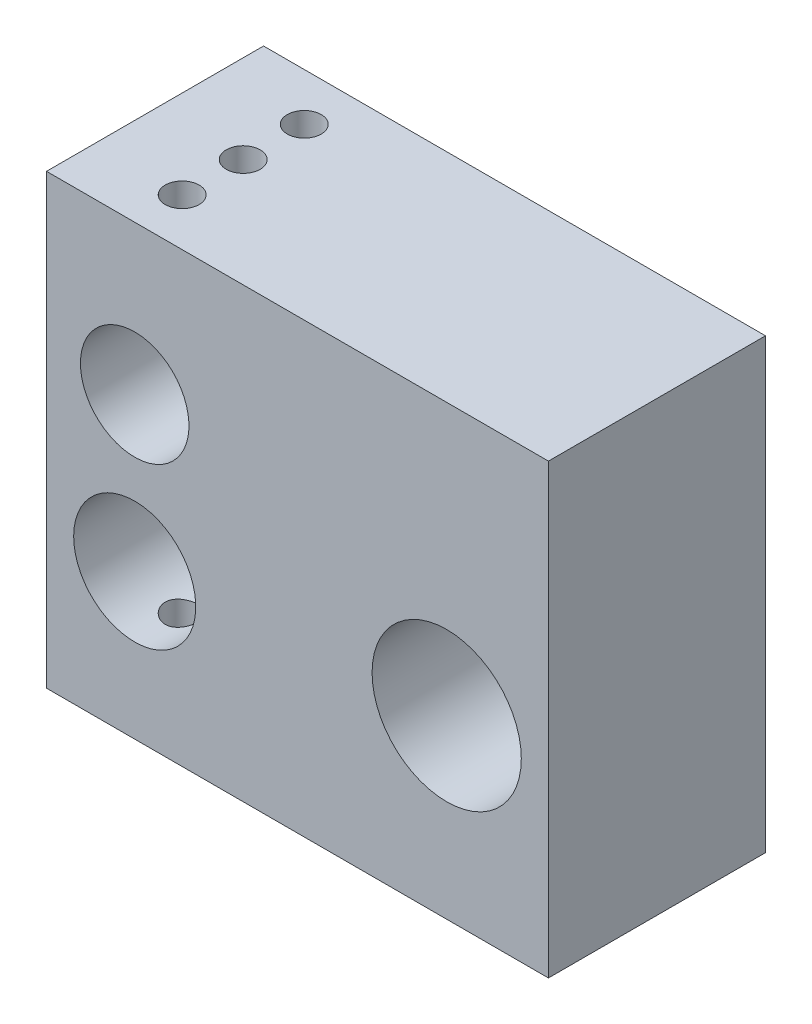
ISO-10303-21;
HEADER;
FILE_DESCRIPTION(('STEP AP214'),'2;1');
FILE_NAME('part.step','',(''),(''),'','','');
FILE_SCHEMA(('AUTOMOTIVE_DESIGN { 1 0 10303 214 1 1 1 1 }'));
ENDSEC;
DATA;
#1=APPLICATION_CONTEXT('core data for automotive mechanical design processes');
#2=APPLICATION_PROTOCOL_DEFINITION('international standard','automotive_design',2000,#1);
#3=PRODUCT_CONTEXT('',#1,'mechanical');
#4=PRODUCT('Part','Part','',(#3));
#5=PRODUCT_RELATED_PRODUCT_CATEGORY('part','',(#4));
#6=PRODUCT_DEFINITION_FORMATION('','',#4);
#7=PRODUCT_DEFINITION_CONTEXT('part definition',#1,'design');
#8=PRODUCT_DEFINITION('design','',#6,#7);
#9=PRODUCT_DEFINITION_SHAPE('','',#8);
#10=(LENGTH_UNIT() NAMED_UNIT(*) SI_UNIT(.MILLI.,.METRE.));
#11=(NAMED_UNIT(*) PLANE_ANGLE_UNIT() SI_UNIT($,.RADIAN.));
#12=(NAMED_UNIT(*) SI_UNIT($,.STERADIAN.) SOLID_ANGLE_UNIT());
#13=UNCERTAINTY_MEASURE_WITH_UNIT(LENGTH_MEASURE(1.E-05),#10,'distance_accuracy_value','');
#14=(GEOMETRIC_REPRESENTATION_CONTEXT(3) GLOBAL_UNCERTAINTY_ASSIGNED_CONTEXT((#13)) GLOBAL_UNIT_ASSIGNED_CONTEXT((#10,
#11,#12)) REPRESENTATION_CONTEXT('',''));
#15=CARTESIAN_POINT('',(0.,0.,0.));
#16=DIRECTION('',(0.,0.,1.));
#17=DIRECTION('',(1.,0.,0.));
#18=AXIS2_PLACEMENT_3D('',#15,#16,#17);
#19=CARTESIAN_POINT('',(-18.5,16.5,8.));
#20=DIRECTION('',(1.,0.,0.));
#21=DIRECTION('',(0.,0.,-1.));
#22=AXIS2_PLACEMENT_3D('',#19,#20,#21);
#23=PLANE('',#22);
#24=DIRECTION('',(0.,0.,1.));
#25=VECTOR('',#24,1.);
#26=CARTESIAN_POINT('',(-18.5,-16.5,8.));
#27=LINE('',#26,#25);
#28=CARTESIAN_POINT('',(-18.5,-16.5,-8.));
#29=VERTEX_POINT('',#28);
#30=CARTESIAN_POINT('',(-18.5,-16.5,8.));
#31=VERTEX_POINT('',#30);
#32=EDGE_CURVE('E99',#29,#31,#27,.T.);
#33=ORIENTED_EDGE('',*,*,#32,.T.);
#34=DIRECTION('',(0.,-1.,0.));
#35=VECTOR('',#34,1.);
#36=CARTESIAN_POINT('',(-18.5,16.5,8.));
#37=LINE('',#36,#35);
#38=CARTESIAN_POINT('',(-18.5,16.5,8.));
#39=VERTEX_POINT('',#38);
#40=EDGE_CURVE('E11',#39,#31,#37,.T.);
#41=ORIENTED_EDGE('',*,*,#40,.F.);
#42=DIRECTION('',(0.,0.,1.));
#43=VECTOR('',#42,1.);
#44=CARTESIAN_POINT('',(-18.5,16.5,8.));
#45=LINE('',#44,#43);
#46=CARTESIAN_POINT('',(-18.5,16.5,-8.));
#47=VERTEX_POINT('',#46);
#48=EDGE_CURVE('E87',#47,#39,#45,.T.);
#49=ORIENTED_EDGE('',*,*,#48,.F.);
#50=DIRECTION('',(0.,-1.,0.));
#51=VECTOR('',#50,1.);
#52=CARTESIAN_POINT('',(-18.5,16.5,-8.));
#53=LINE('',#52,#51);
#54=EDGE_CURVE('E95',#47,#29,#53,.T.);
#55=ORIENTED_EDGE('',*,*,#54,.T.);
#56=EDGE_LOOP('',(#33,#41,#49,#55));
#57=FACE_BOUND('',#56,.T.);
#58=ADVANCED_FACE('F36',(#57),#23,.F.);
#59=CARTESIAN_POINT('',(18.5,16.5,8.));
#60=DIRECTION('',(0.,0.,-1.));
#61=DIRECTION('',(-1.,0.,0.));
#62=AXIS2_PLACEMENT_3D('',#59,#60,#61);
#63=PLANE('',#62);
#64=CARTESIAN_POINT('',(-12.,5.5,8.00000000000001));
#65=DIRECTION('',(0.,0.,-1.));
#66=DIRECTION('',(-1.,0.,0.));
#67=AXIS2_PLACEMENT_3D('',#64,#65,#66);
#68=CIRCLE('',#67,4.);
#69=CARTESIAN_POINT('',(-16.,5.5,8.00000000000001));
#70=VERTEX_POINT('',#69);
#71=EDGE_CURVE('E122',#70,#70,#68,.T.);
#72=ORIENTED_EDGE('',*,*,#71,.T.);
#73=EDGE_LOOP('',(#72));
#74=FACE_BOUND('',#73,.T.);
#75=CARTESIAN_POINT('',(-12.,-5.8,8.00000000000001));
#76=DIRECTION('',(0.,0.,-1.));
#77=DIRECTION('',(-1.,0.,0.));
#78=AXIS2_PLACEMENT_3D('',#75,#76,#77);
#79=CIRCLE('',#78,4.5);
#80=CARTESIAN_POINT('',(-16.5,-5.8,8.00000000000001));
#81=VERTEX_POINT('',#80);
#82=EDGE_CURVE('E116',#81,#81,#79,.T.);
#83=ORIENTED_EDGE('',*,*,#82,.T.);
#84=EDGE_LOOP('',(#83));
#85=FACE_BOUND('',#84,.T.);
#86=CARTESIAN_POINT('',(11.,-3.5,8.));
#87=DIRECTION('',(0.,0.,1.));
#88=DIRECTION('',(1.,0.,0.));
#89=AXIS2_PLACEMENT_3D('',#86,#87,#88);
#90=CIRCLE('',#89,5.5);
#91=CARTESIAN_POINT('',(16.5,-3.5,8.));
#92=VERTEX_POINT('',#91);
#93=EDGE_CURVE('E113',#92,#92,#90,.T.);
#94=ORIENTED_EDGE('',*,*,#93,.F.);
#95=EDGE_LOOP('',(#94));
#96=FACE_BOUND('',#95,.T.);
#97=DIRECTION('',(1.,0.,0.));
#98=VECTOR('',#97,1.);
#99=CARTESIAN_POINT('',(18.5,-16.5,8.));
#100=LINE('',#99,#98);
#101=CARTESIAN_POINT('',(18.5,-16.5,8.));
#102=VERTEX_POINT('',#101);
#103=EDGE_CURVE('E91',#31,#102,#100,.T.);
#104=ORIENTED_EDGE('',*,*,#103,.T.);
#105=DIRECTION('',(0.,-1.,0.));
#106=VECTOR('',#105,1.);
#107=CARTESIAN_POINT('',(18.5,16.5,8.));
#108=LINE('',#107,#106);
#109=CARTESIAN_POINT('',(18.5,16.5,8.));
#110=VERTEX_POINT('',#109);
#111=EDGE_CURVE('E44',#110,#102,#108,.T.);
#112=ORIENTED_EDGE('',*,*,#111,.F.);
#113=DIRECTION('',(1.,0.,0.));
#114=VECTOR('',#113,1.);
#115=CARTESIAN_POINT('',(18.5,16.5,8.));
#116=LINE('',#115,#114);
#117=EDGE_CURVE('E82',#39,#110,#116,.T.);
#118=ORIENTED_EDGE('',*,*,#117,.F.);
#119=ORIENTED_EDGE('',*,*,#40,.T.);
#120=EDGE_LOOP('',(#104,#112,#118,#119));
#121=FACE_BOUND('',#120,.T.);
#122=ADVANCED_FACE('F90',(#74,#85,#96,#121),#63,.F.);
#123=CARTESIAN_POINT('',(18.5,16.5,8.));
#124=DIRECTION('',(-1.,0.,0.));
#125=DIRECTION('',(0.,0.,1.));
#126=AXIS2_PLACEMENT_3D('',#123,#124,#125);
#127=PLANE('',#126);
#128=DIRECTION('',(0.,0.,-1.));
#129=VECTOR('',#128,1.);
#130=CARTESIAN_POINT('',(18.5,-16.5,8.));
#131=LINE('',#130,#129);
#132=CARTESIAN_POINT('',(18.5,-16.5,-8.));
#133=VERTEX_POINT('',#132);
#134=EDGE_CURVE('E69',#102,#133,#131,.T.);
#135=ORIENTED_EDGE('',*,*,#134,.T.);
#136=DIRECTION('',(0.,-1.,0.));
#137=VECTOR('',#136,1.);
#138=CARTESIAN_POINT('',(18.5,16.5,-8.));
#139=LINE('',#138,#137);
#140=CARTESIAN_POINT('',(18.5,16.5,-8.));
#141=VERTEX_POINT('',#140);
#142=EDGE_CURVE('E92',#141,#133,#139,.T.);
#143=ORIENTED_EDGE('',*,*,#142,.F.);
#144=DIRECTION('',(0.,0.,-1.));
#145=VECTOR('',#144,1.);
#146=CARTESIAN_POINT('',(18.5,16.5,8.));
#147=LINE('',#146,#145);
#148=EDGE_CURVE('E85',#110,#141,#147,.T.);
#149=ORIENTED_EDGE('',*,*,#148,.F.);
#150=ORIENTED_EDGE('',*,*,#111,.T.);
#151=EDGE_LOOP('',(#135,#143,#149,#150));
#152=FACE_BOUND('',#151,.T.);
#153=ADVANCED_FACE('F93',(#152),#127,.F.);
#154=CARTESIAN_POINT('',(18.5,16.5,-8.));
#155=DIRECTION('',(0.,0.,1.));
#156=DIRECTION('',(1.,0.,0.));
#157=AXIS2_PLACEMENT_3D('',#154,#155,#156);
#158=PLANE('',#157);
#159=CARTESIAN_POINT('',(-12.,5.5,-8.));
#160=DIRECTION('',(0.,0.,-1.));
#161=DIRECTION('',(-1.,0.,0.));
#162=AXIS2_PLACEMENT_3D('',#159,#160,#161);
#163=CIRCLE('',#162,4.);
#164=CARTESIAN_POINT('',(-16.,5.5,-8.));
#165=VERTEX_POINT('',#164);
#166=EDGE_CURVE('E125',#165,#165,#163,.T.);
#167=ORIENTED_EDGE('',*,*,#166,.F.);
#168=EDGE_LOOP('',(#167));
#169=FACE_BOUND('',#168,.T.);
#170=CARTESIAN_POINT('',(-12.,-5.8,-8.));
#171=DIRECTION('',(0.,0.,-1.));
#172=DIRECTION('',(-1.,0.,0.));
#173=AXIS2_PLACEMENT_3D('',#170,#171,#172);
#174=CIRCLE('',#173,4.5);
#175=CARTESIAN_POINT('',(-16.5,-5.8,-8.));
#176=VERTEX_POINT('',#175);
#177=EDGE_CURVE('E119',#176,#176,#174,.T.);
#178=ORIENTED_EDGE('',*,*,#177,.F.);
#179=EDGE_LOOP('',(#178));
#180=FACE_BOUND('',#179,.T.);
#181=CARTESIAN_POINT('',(11.,-3.5,-8.));
#182=DIRECTION('',(0.,0.,1.));
#183=DIRECTION('',(1.,0.,0.));
#184=AXIS2_PLACEMENT_3D('',#181,#182,#183);
#185=CIRCLE('',#184,5.5);
#186=CARTESIAN_POINT('',(16.5,-3.5,-8.));
#187=VERTEX_POINT('',#186);
#188=EDGE_CURVE('E102',#187,#187,#185,.T.);
#189=ORIENTED_EDGE('',*,*,#188,.T.);
#190=EDGE_LOOP('',(#189));
#191=FACE_BOUND('',#190,.T.);
#192=DIRECTION('',(-1.,0.,0.));
#193=VECTOR('',#192,1.);
#194=CARTESIAN_POINT('',(18.5,-16.5,-8.));
#195=LINE('',#194,#193);
#196=EDGE_CURVE('E75',#133,#29,#195,.T.);
#197=ORIENTED_EDGE('',*,*,#196,.T.);
#198=ORIENTED_EDGE('',*,*,#54,.F.);
#199=DIRECTION('',(-1.,0.,0.));
#200=VECTOR('',#199,1.);
#201=CARTESIAN_POINT('',(18.5,16.5,-8.));
#202=LINE('',#201,#200);
#203=EDGE_CURVE('E52',#141,#47,#202,.T.);
#204=ORIENTED_EDGE('',*,*,#203,.F.);
#205=ORIENTED_EDGE('',*,*,#142,.T.);
#206=EDGE_LOOP('',(#197,#198,#204,#205));
#207=FACE_BOUND('',#206,.T.);
#208=ADVANCED_FACE('F107',(#169,#180,#191,#207),#158,.F.);
#209=CARTESIAN_POINT('',(0.,16.5,0.));
#210=DIRECTION('',(0.,1.,0.));
#211=DIRECTION('',(0.,0.,1.));
#212=AXIS2_PLACEMENT_3D('',#209,#210,#211);
#213=PLANE('',#212);
#214=CARTESIAN_POINT('',(-12.,16.5,0.));
#215=DIRECTION('',(0.,1.,0.));
#216=DIRECTION('',(0.,0.,1.));
#217=AXIS2_PLACEMENT_3D('',#214,#215,#216);
#218=CIRCLE('',#217,1.24999999999999);
#219=CARTESIAN_POINT('',(-12.,16.5,1.25));
#220=VERTEX_POINT('',#219);
#221=EDGE_CURVE('E193',#220,#220,#218,.T.);
#222=ORIENTED_EDGE('',*,*,#221,.F.);
#223=EDGE_LOOP('',(#222));
#224=FACE_BOUND('',#223,.T.);
#225=CARTESIAN_POINT('',(-12.,16.5,4.5));
#226=DIRECTION('',(0.,1.,0.));
#227=DIRECTION('',(0.,0.,1.));
#228=AXIS2_PLACEMENT_3D('',#225,#226,#227);
#229=CIRCLE('',#228,1.24999999999999);
#230=CARTESIAN_POINT('',(-12.,16.5,5.74999999999999));
#231=VERTEX_POINT('',#230);
#232=EDGE_CURVE('E157',#231,#231,#229,.T.);
#233=ORIENTED_EDGE('',*,*,#232,.F.);
#234=EDGE_LOOP('',(#233));
#235=FACE_BOUND('',#234,.T.);
#236=CARTESIAN_POINT('',(-12.,16.5,-4.5));
#237=DIRECTION('',(0.,1.,0.));
#238=DIRECTION('',(0.,0.,1.));
#239=AXIS2_PLACEMENT_3D('',#236,#237,#238);
#240=CIRCLE('',#239,1.24999999999999);
#241=CARTESIAN_POINT('',(-12.,16.5,-3.25000000000001));
#242=VERTEX_POINT('',#241);
#243=EDGE_CURVE('E137',#242,#242,#240,.T.);
#244=ORIENTED_EDGE('',*,*,#243,.F.);
#245=EDGE_LOOP('',(#244));
#246=FACE_BOUND('',#245,.T.);
#247=ORIENTED_EDGE('',*,*,#48,.T.);
#248=ORIENTED_EDGE('',*,*,#117,.T.);
#249=ORIENTED_EDGE('',*,*,#148,.T.);
#250=ORIENTED_EDGE('',*,*,#203,.T.);
#251=EDGE_LOOP('',(#247,#248,#249,#250));
#252=FACE_BOUND('',#251,.T.);
#253=ADVANCED_FACE('F83',(#224,#235,#246,#252),#213,.T.);
#254=CARTESIAN_POINT('',(0.,-16.5,0.));
#255=DIRECTION('',(0.,1.,0.));
#256=DIRECTION('',(0.,0.,1.));
#257=AXIS2_PLACEMENT_3D('',#254,#255,#256);
#258=PLANE('',#257);
#259=CARTESIAN_POINT('',(-12.,-16.5,4.5));
#260=DIRECTION('',(0.,-1.,0.));
#261=DIRECTION('',(0.,0.,-1.));
#262=AXIS2_PLACEMENT_3D('',#259,#260,#261);
#263=CIRCLE('',#262,1.24999999999999);
#264=CARTESIAN_POINT('',(-12.,-16.5,3.25000000000002));
#265=VERTEX_POINT('',#264);
#266=EDGE_CURVE('E184',#265,#265,#263,.T.);
#267=ORIENTED_EDGE('',*,*,#266,.F.);
#268=EDGE_LOOP('',(#267));
#269=FACE_BOUND('',#268,.T.);
#270=CARTESIAN_POINT('',(-12.,-16.5,-4.5));
#271=DIRECTION('',(0.,-1.,0.));
#272=DIRECTION('',(0.,0.,-1.));
#273=AXIS2_PLACEMENT_3D('',#270,#271,#272);
#274=CIRCLE('',#273,1.24999999999999);
#275=CARTESIAN_POINT('',(-12.,-16.5,-5.74999999999999));
#276=VERTEX_POINT('',#275);
#277=EDGE_CURVE('E166',#276,#276,#274,.T.);
#278=ORIENTED_EDGE('',*,*,#277,.F.);
#279=EDGE_LOOP('',(#278));
#280=FACE_BOUND('',#279,.T.);
#281=ORIENTED_EDGE('',*,*,#32,.F.);
#282=ORIENTED_EDGE('',*,*,#196,.F.);
#283=ORIENTED_EDGE('',*,*,#134,.F.);
#284=ORIENTED_EDGE('',*,*,#103,.F.);
#285=EDGE_LOOP('',(#281,#282,#283,#284));
#286=FACE_BOUND('',#285,.T.);
#287=ADVANCED_FACE('F110',(#269,#280,#286),#258,.F.);
#288=CARTESIAN_POINT('',(11.,-3.5,-8.));
#289=DIRECTION('',(0.,0.,1.));
#290=DIRECTION('',(1.,0.,0.));
#291=AXIS2_PLACEMENT_3D('',#288,#289,#290);
#292=CYLINDRICAL_SURFACE('',#291,5.5);
#293=ORIENTED_EDGE('',*,*,#188,.F.);
#294=EDGE_LOOP('',(#293));
#295=FACE_BOUND('',#294,.T.);
#296=ORIENTED_EDGE('',*,*,#93,.T.);
#297=EDGE_LOOP('',(#296));
#298=FACE_BOUND('',#297,.T.);
#299=ADVANCED_FACE('F221',(#295,#298),#292,.F.);
#300=CARTESIAN_POINT('',(-12.,-5.8,8.00000000000001));
#301=DIRECTION('',(0.,0.,-1.));
#302=DIRECTION('',(-1.,0.,0.));
#303=AXIS2_PLACEMENT_3D('',#300,#301,#302);
#304=CYLINDRICAL_SURFACE('',#303,4.5);
#305=CARTESIAN_POINT('',(-12.,-10.3,3.25000000000001));
#306=CARTESIAN_POINT('',(-11.9311987491168,-10.2999990801693,3.25000139958524));
#307=CARTESIAN_POINT('',(-11.8623828762473,-10.2984067408683,3.25569931980531));
#308=CARTESIAN_POINT('',(-11.7267405240058,-10.2922095019824,3.27829572826533));
#309=CARTESIAN_POINT('',(-11.6599148963366,-10.2876033314925,3.29519894171373));
#310=CARTESIAN_POINT('',(-11.5302300503197,-10.275885653946,3.33960871941394));
#311=CARTESIAN_POINT('',(-11.4673656099043,-10.2687775303096,3.36710096869843));
#312=CARTESIAN_POINT('',(-11.3471393047582,-10.25280312582,3.43185350632688));
#313=CARTESIAN_POINT('',(-11.2897779291877,-10.2439366888869,3.46911466191927));
#314=CARTESIAN_POINT('',(-11.1807532152841,-10.2251515781749,3.55332943384287));
#315=CARTESIAN_POINT('',(-11.1292468871915,-10.215213736237,3.60048203968756));
#316=CARTESIAN_POINT('',(-11.0347618143037,-10.1955260711726,3.7027162771216));
#317=CARTESIAN_POINT('',(-10.9917842691545,-10.1857762746702,3.75779902227524));
#318=CARTESIAN_POINT('',(-10.9147919141968,-10.1673704429455,3.87560726012932));
#319=CARTESIAN_POINT('',(-10.8809612505216,-10.1587384794598,3.93845720844372));
#320=CARTESIAN_POINT('',(-10.8244104286886,-10.143829008083,4.06923191764013));
#321=CARTESIAN_POINT('',(-10.8016880266376,-10.1375510247425,4.13715565040817));
#322=CARTESIAN_POINT('',(-10.7685507563204,-10.1282588314288,4.27440278885413));
#323=CARTESIAN_POINT('',(-10.757849630957,-10.125168860032,4.34365182163988));
#324=CARTESIAN_POINT('',(-10.7481657292203,-10.122376493848,4.48302588556283));
#325=CARTESIAN_POINT('',(-10.749180559727,-10.1226734072502,4.5531507348812));
#326=CARTESIAN_POINT('',(-10.7626732866238,-10.1265536680145,4.69002227872271));
#327=CARTESIAN_POINT('',(-10.7748009772933,-10.1300366066859,4.75680680149622));
#328=CARTESIAN_POINT('',(-10.809612687981,-10.1397351705348,4.8873536285916));
#329=CARTESIAN_POINT('',(-10.8322976154284,-10.1459510306134,4.95111567260226));
#330=CARTESIAN_POINT('',(-10.8878562686554,-10.1605006977575,5.07470223145528));
#331=CARTESIAN_POINT('',(-10.9208497816301,-10.168859186002,5.13446986681006));
#332=CARTESIAN_POINT('',(-10.9960055932037,-10.186739506843,5.24774157559124));
#333=CARTESIAN_POINT('',(-11.0381698337094,-10.1962615856432,5.30124431872614));
#334=CARTESIAN_POINT('',(-11.1322443897156,-10.2158107212683,5.40246388043642));
#335=CARTESIAN_POINT('',(-11.1844477202977,-10.2258437003779,5.44990763487985));
#336=CARTESIAN_POINT('',(-11.296193392799,-10.2449819981083,5.53542573077781));
#337=CARTESIAN_POINT('',(-11.355736074578,-10.2540872737346,5.57349963810248));
#338=CARTESIAN_POINT('',(-11.4809165706619,-10.2704083971276,5.63933181563007));
#339=CARTESIAN_POINT('',(-11.5465836042523,-10.2776144864553,5.6670371039389));
#340=CARTESIAN_POINT('',(-11.6818900112303,-10.2892549250145,5.71093409844137));
#341=CARTESIAN_POINT('',(-11.7515284358789,-10.293689933237,5.72712854215656));
#342=CARTESIAN_POINT('',(-11.8904733922869,-10.2991873648341,5.74710713677897));
#343=CARTESIAN_POINT('',(-11.9597226941413,-10.3003505382403,5.75126214490716));
#344=CARTESIAN_POINT('',(-12.0979299306366,-10.2994648029316,5.74807300170757));
#345=CARTESIAN_POINT('',(-12.1668878972845,-10.2974162567817,5.74073014835195));
#346=CARTESIAN_POINT('',(-12.3012069134709,-10.2904026505903,5.71505666588036));
#347=CARTESIAN_POINT('',(-12.3666112881639,-10.2854933716758,5.69693605494248));
#348=CARTESIAN_POINT('',(-12.4934431181187,-10.2733182916935,5.6504681323619));
#349=CARTESIAN_POINT('',(-12.5548701239724,-10.2660522248846,5.62211966743049));
#350=CARTESIAN_POINT('',(-12.6734201404054,-10.2497374028418,5.5553341219535));
#351=CARTESIAN_POINT('',(-12.7304270619535,-10.2406547134057,5.51669947567733));
#352=CARTESIAN_POINT('',(-12.837277670587,-10.2217547712821,5.43068386419253));
#353=CARTESIAN_POINT('',(-12.8871198146314,-10.2119373610519,5.38330101993424));
#354=CARTESIAN_POINT('',(-12.979812026945,-10.1922984268438,5.27939855612165));
#355=CARTESIAN_POINT('',(-13.0223995788538,-10.1824860820796,5.22264254844243));
#356=CARTESIAN_POINT('',(-13.0974558142901,-10.1642969330427,5.10257936212026));
#357=CARTESIAN_POINT('',(-13.1299248848246,-10.1559200738716,5.0392724341574));
#358=CARTESIAN_POINT('',(-13.1835810583415,-10.1416479895617,4.90819283011683));
#359=CARTESIAN_POINT('',(-13.2048307748478,-10.1357390309604,4.84044736224536));
#360=CARTESIAN_POINT('',(-13.2355765249536,-10.1270787689278,4.70215029058324));
#361=CARTESIAN_POINT('',(-13.2450758790657,-10.1243265734489,4.63159948536688));
#362=CARTESIAN_POINT('',(-13.2518485997432,-10.1223703832988,4.49239422050922));
#363=CARTESIAN_POINT('',(-13.2495457101458,-10.1230434046118,4.42376180998806));
#364=CARTESIAN_POINT('',(-13.2337714328726,-10.1275713705212,4.28790510620532));
#365=CARTESIAN_POINT('',(-13.2203003804941,-10.1314262195909,4.22068077073177));
#366=CARTESIAN_POINT('',(-13.1828272424861,-10.14180718808,4.09013276608194));
#367=CARTESIAN_POINT('',(-13.1589221464112,-10.1483086691328,4.02677915735225));
#368=CARTESIAN_POINT('',(-13.1013345167073,-10.1632491605205,3.90493257749269));
#369=CARTESIAN_POINT('',(-13.0676503335869,-10.171688497674,3.84644042851432));
#370=CARTESIAN_POINT('',(-12.990206962021,-10.1898881078538,3.73397234717483));
#371=CARTESIAN_POINT('',(-12.9461620843463,-10.1996817898226,3.68019852331728));
#372=CARTESIAN_POINT('',(-12.8497815274507,-10.2193083190936,3.58066762794655));
#373=CARTESIAN_POINT('',(-12.7974437956282,-10.2291411755031,3.53491254710902));
#374=CARTESIAN_POINT('',(-12.6844602323079,-10.2480183958155,3.45164186342193));
#375=CARTESIAN_POINT('',(-12.6236462589322,-10.2570384119279,3.41434837668933));
#376=CARTESIAN_POINT('',(-12.4963619826928,-10.2729997490061,3.35057186071053));
#377=CARTESIAN_POINT('',(-12.4298950301767,-10.2799422903534,3.32408248141899));
#378=CARTESIAN_POINT('',(-12.3031454837667,-10.2901607483195,3.28577991926531));
#379=CARTESIAN_POINT('',(-12.2433644021687,-10.2938224566186,3.27239521240714));
#380=CARTESIAN_POINT('',(-12.1223926256934,-10.2987423497629,3.25450515417747));
#381=CARTESIAN_POINT('',(-12.0612020980194,-10.3000008182347,3.24999875500008));
#382=CARTESIAN_POINT('',(-12.,-10.3,3.25000000000001));
#383=B_SPLINE_CURVE_WITH_KNOTS('',3,(#305,#306,#307,#308,#309,#310,#311,#312,#313,#314,#315,
#316,#317,#318,#319,#320,#321,#322,#323,#324,#325,#326,#327,#328,#329,#330,#331,#332,#333,#334,
#335,#336,#337,#338,#339,#340,#341,#342,#343,#344,#345,#346,#347,#348,#349,#350,#351,#352,#353,
#354,#355,#356,#357,#358,#359,#360,#361,#362,#363,#364,#365,#366,#367,#368,#369,#370,#371,#372,
#373,#374,#375,#376,#377,#378,#379,#380,#381,#382),.UNSPECIFIED.,.T.,.F.,(4,2,2,2,2,2,2,2,2,2,2,
2,2,2,2,2,2,2,2,2,2,2,2,2,2,2,2,2,2,2,2,2,2,2,2,2,2,2,4),(0.,0.20617919309949,0.412445386147259,
0.618433707942853,0.824440322837929,1.03507624325264,1.24574177043995,1.46037690323671,
1.67496866133383,1.88433431939188,2.09365721284143,2.29660232990421,2.49956489399152,
2.70497960040654,2.91043784592673,3.1231949383816,3.33596188658144,3.54980165635948,
3.76359055350005,3.97072010588424,4.17782627748475,4.38102317477484,4.58424299163036,
4.79168948884223,4.99918059600961,5.21305991702848,5.42693105668197,5.63959564853969,
5.85220013017264,6.05722599244304,6.26224569952545,6.46539893556021,6.66858645848125,
6.87821913273767,7.08790377540616,7.30258090584729,7.51713167871714,7.70055986525025,
7.8839664025393),.UNSPECIFIED.);
#384=CARTESIAN_POINT('',(-12.,-10.3,3.25000000000001));
#385=VERTEX_POINT('',#384);
#386=EDGE_CURVE('E179',#385,#385,#383,.T.);
#387=ORIENTED_EDGE('',*,*,#386,.T.);
#388=EDGE_LOOP('',(#387));
#389=FACE_BOUND('',#388,.T.);
#390=CARTESIAN_POINT('',(-12.,-10.3,-5.74999999999999));
#391=CARTESIAN_POINT('',(-11.9311987491168,-10.2999990801693,-5.74999860041476));
#392=CARTESIAN_POINT('',(-11.8623828762473,-10.2984067408683,-5.7443006801947));
#393=CARTESIAN_POINT('',(-11.7267405240058,-10.2922095019824,-5.72170427173467));
#394=CARTESIAN_POINT('',(-11.6599148963366,-10.2876033314925,-5.70480105828627));
#395=CARTESIAN_POINT('',(-11.5302300503197,-10.275885653946,-5.66039128058607));
#396=CARTESIAN_POINT('',(-11.4673656099043,-10.2687775303096,-5.63289903130158));
#397=CARTESIAN_POINT('',(-11.3471393047582,-10.25280312582,-5.56814649367313));
#398=CARTESIAN_POINT('',(-11.2897779291877,-10.2439366888869,-5.53088533808074));
#399=CARTESIAN_POINT('',(-11.1807532152841,-10.2251515781749,-5.44667056615713));
#400=CARTESIAN_POINT('',(-11.1292468871915,-10.215213736237,-5.39951796031245));
#401=CARTESIAN_POINT('',(-11.0347618143037,-10.1955260711726,-5.2972837228784));
#402=CARTESIAN_POINT('',(-10.9917842691545,-10.1857762746702,-5.24220097772476));
#403=CARTESIAN_POINT('',(-10.9147919141968,-10.1673704429455,-5.12439273987068));
#404=CARTESIAN_POINT('',(-10.8809612505216,-10.1587384794598,-5.06154279155628));
#405=CARTESIAN_POINT('',(-10.8244104286886,-10.143829008083,-4.93076808235988));
#406=CARTESIAN_POINT('',(-10.8016880266376,-10.1375510247425,-4.86284434959184));
#407=CARTESIAN_POINT('',(-10.7685507563205,-10.1282588314288,-4.72559721114588));
#408=CARTESIAN_POINT('',(-10.757849630957,-10.125168860032,-4.65634817836012));
#409=CARTESIAN_POINT('',(-10.7481657292203,-10.122376493848,-4.51697411443717));
#410=CARTESIAN_POINT('',(-10.749180559727,-10.1226734072502,-4.44684926511881));
#411=CARTESIAN_POINT('',(-10.7626732866238,-10.1265536680145,-4.3099777212773));
#412=CARTESIAN_POINT('',(-10.7748009772933,-10.1300366066859,-4.24319319850379));
#413=CARTESIAN_POINT('',(-10.809612687981,-10.1397351705348,-4.11264637140841));
#414=CARTESIAN_POINT('',(-10.8322976154284,-10.1459510306134,-4.04888432739775));
#415=CARTESIAN_POINT('',(-10.8878562686554,-10.1605006977575,-3.92529776854472));
#416=CARTESIAN_POINT('',(-10.9208497816301,-10.168859186002,-3.86553013318995));
#417=CARTESIAN_POINT('',(-10.9960055932037,-10.186739506843,-3.75225842440876));
#418=CARTESIAN_POINT('',(-11.0381698337094,-10.1962615856432,-3.69875568127387));
#419=CARTESIAN_POINT('',(-11.1322443897156,-10.2158107212683,-3.59753611956359));
#420=CARTESIAN_POINT('',(-11.1844477202977,-10.2258437003779,-3.55009236512016));
#421=CARTESIAN_POINT('',(-11.296193392799,-10.2449819981083,-3.4645742692222));
#422=CARTESIAN_POINT('',(-11.355736074578,-10.2540872737346,-3.42650036189753));
#423=CARTESIAN_POINT('',(-11.4809165706619,-10.2704083971276,-3.36066818436993));
#424=CARTESIAN_POINT('',(-11.5465836042523,-10.2776144864553,-3.3329628960611));
#425=CARTESIAN_POINT('',(-11.6818900112303,-10.2892549250145,-3.28906590155864));
#426=CARTESIAN_POINT('',(-11.7515284358789,-10.293689933237,-3.27287145784344));
#427=CARTESIAN_POINT('',(-11.8904733922869,-10.2991873648341,-3.25289286322103));
#428=CARTESIAN_POINT('',(-11.9597226941413,-10.3003505382403,-3.24873785509284));
#429=CARTESIAN_POINT('',(-12.0979299306366,-10.2994648029316,-3.25192699829244));
#430=CARTESIAN_POINT('',(-12.1668878972845,-10.2974162567817,-3.25926985164806));
#431=CARTESIAN_POINT('',(-12.3012069134709,-10.2904026505903,-3.28494333411964));
#432=CARTESIAN_POINT('',(-12.3666112881639,-10.2854933716758,-3.30306394505753));
#433=CARTESIAN_POINT('',(-12.4934431181187,-10.2733182916935,-3.3495318676381));
#434=CARTESIAN_POINT('',(-12.5548701239724,-10.2660522248846,-3.37788033256952));
#435=CARTESIAN_POINT('',(-12.6734201404054,-10.2497374028418,-3.4446658780465));
#436=CARTESIAN_POINT('',(-12.7304270619535,-10.2406547134057,-3.48330052432267));
#437=CARTESIAN_POINT('',(-12.837277670587,-10.2217547712821,-3.56931613580747));
#438=CARTESIAN_POINT('',(-12.8871198146314,-10.2119373610519,-3.61669898006577));
#439=CARTESIAN_POINT('',(-12.9798120269449,-10.1922984268438,-3.72060144387835));
#440=CARTESIAN_POINT('',(-13.0223995788538,-10.1824860820796,-3.77735745155757));
#441=CARTESIAN_POINT('',(-13.0974558142901,-10.1642969330427,-3.89742063787974));
#442=CARTESIAN_POINT('',(-13.1299248848246,-10.1559200738716,-3.9607275658426));
#443=CARTESIAN_POINT('',(-13.1835810583415,-10.1416479895617,-4.09180716988317));
#444=CARTESIAN_POINT('',(-13.2048307748478,-10.1357390309604,-4.15955263775464));
#445=CARTESIAN_POINT('',(-13.2355765249536,-10.1270787689278,-4.29784970941676));
#446=CARTESIAN_POINT('',(-13.2450758790657,-10.1243265734489,-4.36840051463312));
#447=CARTESIAN_POINT('',(-13.2518485997432,-10.1223703832988,-4.50760577949078));
#448=CARTESIAN_POINT('',(-13.2495457101458,-10.1230434046118,-4.57623819001194));
#449=CARTESIAN_POINT('',(-13.2337714328726,-10.1275713705212,-4.71209489379468));
#450=CARTESIAN_POINT('',(-13.2203003804941,-10.1314262195909,-4.77931922926823));
#451=CARTESIAN_POINT('',(-13.1828272424861,-10.14180718808,-4.90986723391806));
#452=CARTESIAN_POINT('',(-13.1589221464112,-10.1483086691328,-4.97322084264776));
#453=CARTESIAN_POINT('',(-13.1013345167073,-10.1632491605205,-5.09506742250732));
#454=CARTESIAN_POINT('',(-13.0676503335869,-10.171688497674,-5.15355957148568));
#455=CARTESIAN_POINT('',(-12.990206962021,-10.1898881078538,-5.26602765282517));
#456=CARTESIAN_POINT('',(-12.9461620843463,-10.1996817898226,-5.31980147668272));
#457=CARTESIAN_POINT('',(-12.8497815274507,-10.2193083190936,-5.41933237205345));
#458=CARTESIAN_POINT('',(-12.7974437956282,-10.2291411755031,-5.46508745289098));
#459=CARTESIAN_POINT('',(-12.6844602323079,-10.2480183958155,-5.54835813657808));
#460=CARTESIAN_POINT('',(-12.6236462589322,-10.2570384119279,-5.58565162331068));
#461=CARTESIAN_POINT('',(-12.4963619826928,-10.2729997490061,-5.64942813928947));
#462=CARTESIAN_POINT('',(-12.4298950301767,-10.2799422903534,-5.67591751858101));
#463=CARTESIAN_POINT('',(-12.3031454837667,-10.2901607483195,-5.71422008073469));
#464=CARTESIAN_POINT('',(-12.2433644021687,-10.2938224566186,-5.72760478759287));
#465=CARTESIAN_POINT('',(-12.1223926256934,-10.2987423497629,-5.74549484582254));
#466=CARTESIAN_POINT('',(-12.0612020980194,-10.3000008182347,-5.75000124499992));
#467=CARTESIAN_POINT('',(-12.,-10.3,-5.74999999999999));
#468=B_SPLINE_CURVE_WITH_KNOTS('',3,(#390,#391,#392,#393,#394,#395,#396,#397,#398,#399,#400,
#401,#402,#403,#404,#405,#406,#407,#408,#409,#410,#411,#412,#413,#414,#415,#416,#417,#418,#419,
#420,#421,#422,#423,#424,#425,#426,#427,#428,#429,#430,#431,#432,#433,#434,#435,#436,#437,#438,
#439,#440,#441,#442,#443,#444,#445,#446,#447,#448,#449,#450,#451,#452,#453,#454,#455,#456,#457,
#458,#459,#460,#461,#462,#463,#464,#465,#466,#467),.UNSPECIFIED.,.T.,.F.,(4,2,2,2,2,2,2,2,2,2,2,
2,2,2,2,2,2,2,2,2,2,2,2,2,2,2,2,2,2,2,2,2,2,2,2,2,2,2,4),(0.,0.20617919309949,0.412445386147257,
0.618433707942851,0.824440322837926,1.03507624325263,1.24574177043994,1.46037690323671,
1.67496866133383,1.88433431939188,2.09365721284143,2.2966023299042,2.49956489399151,
2.70497960040654,2.91043784592673,3.1231949383816,3.33596188658144,3.54980165635947,
3.76359055350004,3.97072010588424,4.17782627748474,4.38102317477484,4.58424299163036,
4.79168948884223,4.99918059600961,5.21305991702847,5.42693105668197,5.63959564853968,
5.85220013017263,6.05722599244304,6.26224569952544,6.46539893556021,6.66858645848124,
6.87821913273766,7.08790377540616,7.30258090584728,7.51713167871714,7.70055986525025,
7.8839664025393),.UNSPECIFIED.);
#469=CARTESIAN_POINT('',(-12.,-10.3,-5.74999999999999));
#470=VERTEX_POINT('',#469);
#471=EDGE_CURVE('E160',#470,#470,#468,.T.);
#472=ORIENTED_EDGE('',*,*,#471,.T.);
#473=EDGE_LOOP('',(#472));
#474=FACE_BOUND('',#473,.T.);
#475=ORIENTED_EDGE('',*,*,#82,.F.);
#476=EDGE_LOOP('',(#475));
#477=FACE_BOUND('',#476,.T.);
#478=ORIENTED_EDGE('',*,*,#177,.T.);
#479=EDGE_LOOP('',(#478));
#480=FACE_BOUND('',#479,.T.);
#481=ADVANCED_FACE('F228',(#389,#474,#477,#480),#304,.F.);
#482=CARTESIAN_POINT('',(-12.,5.5,8.00000000000001));
#483=DIRECTION('',(0.,0.,-1.));
#484=DIRECTION('',(-1.,0.,0.));
#485=AXIS2_PLACEMENT_3D('',#482,#483,#484);
#486=CYLINDRICAL_SURFACE('',#485,4.);
#487=CARTESIAN_POINT('',(-12.,9.5,1.25));
#488=CARTESIAN_POINT('',(-11.9315608148255,9.49999965877989,1.24999955341242));
#489=CARTESIAN_POINT('',(-11.8631169474971,9.49822694984841,1.24436077305555));
#490=CARTESIAN_POINT('',(-11.7282307904116,9.49132894088806,1.22201375846076));
#491=CARTESIAN_POINT('',(-11.6617889572741,9.48620288199859,1.20530301863564));
#492=CARTESIAN_POINT('',(-11.5328714563492,9.47315815697909,1.16143062880426));
#493=CARTESIAN_POINT('',(-11.4703898230142,9.46524381499025,1.13428515534703));
#494=CARTESIAN_POINT('',(-11.3508651976535,9.44743969161092,1.07038268232167));
#495=CARTESIAN_POINT('',(-11.2938230645551,9.43754959899905,1.03362416821942));
#496=CARTESIAN_POINT('',(-11.1850346650477,9.41650213740282,0.950344007982643));
#497=CARTESIAN_POINT('',(-11.1334799718433,9.40531715926988,0.903579114938932));
#498=CARTESIAN_POINT('',(-11.038802617963,9.38310046374208,0.802131607586455));
#499=CARTESIAN_POINT('',(-10.9956815271013,9.37206877523457,0.747447522505458));
#500=CARTESIAN_POINT('',(-10.9180566351689,9.35111144698172,0.630055436191922));
#501=CARTESIAN_POINT('',(-10.8837921584987,9.34121988301795,0.567182522472784));
#502=CARTESIAN_POINT('',(-10.8264025892333,9.32407801799234,0.436207685018133));
#503=CARTESIAN_POINT('',(-10.8032745622806,9.31682702128689,0.368107144206075));
#504=CARTESIAN_POINT('',(-10.7695154006997,9.30607606984501,0.230771922547946));
#505=CARTESIAN_POINT('',(-10.7585288999214,9.30246972929508,0.161633156361156));
#506=CARTESIAN_POINT('',(-10.7482544496301,9.2991005514095,0.0224068810881158));
#507=CARTESIAN_POINT('',(-10.7489633900423,9.29933669227334,-0.0476803708216519));
#508=CARTESIAN_POINT('',(-10.7617817526726,9.30353189075438,-0.183874460268974));
#509=CARTESIAN_POINT('',(-10.7734394213062,9.30734341745948,-0.250029125861554));
#510=CARTESIAN_POINT('',(-10.8070918664437,9.31802025652489,-0.379392156537335));
#511=CARTESIAN_POINT('',(-10.8290877415545,9.32488589343115,-0.442600207708788));
#512=CARTESIAN_POINT('',(-10.8831112531872,9.34101044014296,-0.565351944432623));
#513=CARTESIAN_POINT('',(-10.9152807433792,9.35030284660824,-0.62482861069197));
#514=CARTESIAN_POINT('',(-10.9886397926215,9.3702185658007,-0.737687767879111));
#515=CARTESIAN_POINT('',(-11.0298316947842,9.38084222394551,-0.791068670253699));
#516=CARTESIAN_POINT('',(-11.1222830458179,9.40281527800493,-0.892774943416974));
#517=CARTESIAN_POINT('',(-11.1739154294072,9.41417569605695,-0.940759557779669));
#518=CARTESIAN_POINT('',(-11.2846355919045,9.4359157075958,-1.02747189357966));
#519=CARTESIAN_POINT('',(-11.343723922651,9.44629522838372,-1.06619892921919));
#520=CARTESIAN_POINT('',(-11.4683353895345,9.46501294890191,-1.13352768860126));
#521=CARTESIAN_POINT('',(-11.5339050930807,9.47333460648208,-1.16204813546395));
#522=CARTESIAN_POINT('',(-11.6692320222174,9.48687955828554,-1.20755300085155));
#523=CARTESIAN_POINT('',(-11.7389879692754,9.49210379325151,-1.22454092223838));
#524=CARTESIAN_POINT('',(-11.8778148427097,9.49871389395014,-1.24591804257896));
#525=CARTESIAN_POINT('',(-11.9468081512112,9.50024022895439,-1.25076854359351));
#526=CARTESIAN_POINT('',(-12.0846303057326,9.49969799730981,-1.24903377336266));
#527=CARTESIAN_POINT('',(-12.1534591743065,9.49762995581124,-1.24245017267738));
#528=CARTESIAN_POINT('',(-12.2872193329758,9.49022363769771,-1.21840440739359));
#529=CARTESIAN_POINT('',(-12.3522049784209,9.48496793110725,-1.20121673238747));
#530=CARTESIAN_POINT('',(-12.4783519288614,9.47180121379252,-1.1567856476333));
#531=CARTESIAN_POINT('',(-12.539512760449,9.46388987514204,-1.12954099597508));
#532=CARTESIAN_POINT('',(-12.6579324066722,9.44598542759568,-1.06502678345119));
#533=CARTESIAN_POINT('',(-12.715059739788,9.4359462681821,-1.02752901250277));
#534=CARTESIAN_POINT('',(-12.8223658509601,9.41493410002887,-0.943846789882972));
#535=CARTESIAN_POINT('',(-12.8725427380433,9.40396083845862,-0.897659982256873));
#536=CARTESIAN_POINT('',(-12.9665874629196,9.38176994885247,-0.795741109946301));
#537=CARTESIAN_POINT('',(-13.0101265233977,9.37055986714446,-0.739703336254729));
#538=CARTESIAN_POINT('',(-13.0872125024491,9.34961947087602,-0.620873383629249));
#539=CARTESIAN_POINT('',(-13.1207595797252,9.339889132814,-0.558081311995557));
#540=CARTESIAN_POINT('',(-13.1767008348114,9.32311782360754,-0.42765482711413));
#541=CARTESIAN_POINT('',(-13.1991381955889,9.31606646468027,-0.360040350495291));
#542=CARTESIAN_POINT('',(-13.2322289432096,9.30551170941212,-0.221727506676195));
#543=CARTESIAN_POINT('',(-13.2428868141461,9.30200696302675,-0.151030323628677));
#544=CARTESIAN_POINT('',(-13.2517940615754,9.29908292712494,-0.0119959124457502));
#545=CARTESIAN_POINT('',(-13.2505827962196,9.29948604683077,0.0563034538129375));
#546=CARTESIAN_POINT('',(-13.2370881812947,9.30390090472383,0.191674584919185));
#547=CARTESIAN_POINT('',(-13.2248053482256,9.30791247457319,0.258746406884006));
#548=CARTESIAN_POINT('',(-13.1898772991338,9.31896814158112,0.388794039601787));
#549=CARTESIAN_POINT('',(-13.1673864240594,9.32596698183474,0.451815441096019));
#550=CARTESIAN_POINT('',(-13.1128022733506,9.34219704261348,0.573240413531355));
#551=CARTESIAN_POINT('',(-13.0807070444425,9.35142871716522,0.631643042077685));
#552=CARTESIAN_POINT('',(-13.0063567501347,9.3715348703158,0.744645970440569));
#553=CARTESIAN_POINT('',(-12.9637533352413,9.38245948922441,0.799008129500444));
#554=CARTESIAN_POINT('',(-12.8702089964048,9.40448998821726,0.899986328111799));
#555=CARTESIAN_POINT('',(-12.8192658423444,9.41559591606794,0.946600288991007));
#556=CARTESIAN_POINT('',(-12.7084866628233,9.43717271952329,1.03228253836299));
#557=CARTESIAN_POINT('',(-12.6484145744874,9.44761101730634,1.07105473644997));
#558=CARTESIAN_POINT('',(-12.5222791380137,9.46626769296916,1.13789891513944));
#559=CARTESIAN_POINT('',(-12.4562181577954,9.47448694315832,1.16597510214183));
#560=CARTESIAN_POINT('',(-12.325747635374,9.48720650733461,1.20859136760847));
#561=CARTESIAN_POINT('',(-12.2616703371125,9.49196240806139,1.22407486730534));
#562=CARTESIAN_POINT('',(-12.1317298954402,9.49835900340486,1.24477835996771));
#563=CARTESIAN_POINT('',(-12.0658671161397,9.50000032839644,1.250000429804));
#564=CARTESIAN_POINT('',(-12.,9.5,1.25));
#565=B_SPLINE_CURVE_WITH_KNOTS('',3,(#487,#488,#489,#490,#491,#492,#493,#494,#495,#496,#497,
#498,#499,#500,#501,#502,#503,#504,#505,#506,#507,#508,#509,#510,#511,#512,#513,#514,#515,#516,
#517,#518,#519,#520,#521,#522,#523,#524,#525,#526,#527,#528,#529,#530,#531,#532,#533,#534,#535,
#536,#537,#538,#539,#540,#541,#542,#543,#544,#545,#546,#547,#548,#549,#550,#551,#552,#553,#554,
#555,#556,#557,#558,#559,#560,#561,#562,#563,#564),.UNSPECIFIED.,.T.,.F.,(4,2,2,2,2,2,2,2,2,2,2,
2,2,2,2,2,2,2,2,2,2,2,2,2,2,2,2,2,2,2,2,2,2,2,2,2,2,2,4),(0.,0.20507544943251,0.410197323349063,
0.615002479202433,0.819839921558386,1.03037822195158,1.24095567431275,1.45673771247493,
1.67246286279526,1.88169150167209,2.09086450295137,2.29176917422168,2.49269519979061,
2.69655642720544,2.90047066010357,3.11366747279598,3.32688007413301,3.54175460689768,
3.75656384494552,3.96307568548235,4.1695573564936,4.37090626722869,4.57228005034497,
4.7785632473834,4.98490245709256,5.19941778713137,5.41392970983709,5.62760115751028,
5.84119123892427,6.0451220347605,6.24904331751081,6.44997913396668,6.6509558433017,
6.85979514006358,7.06869037373337,7.28440668126408,7.50003806666333,7.69744636651537,
7.89481470763043),.UNSPECIFIED.);
#566=CARTESIAN_POINT('',(-12.,9.5,1.25));
#567=VERTEX_POINT('',#566);
#568=EDGE_CURVE('E187',#567,#567,#565,.T.);
#569=ORIENTED_EDGE('',*,*,#568,.T.);
#570=EDGE_LOOP('',(#569));
#571=FACE_BOUND('',#570,.T.);
#572=CARTESIAN_POINT('',(-12.,9.5,5.75));
#573=CARTESIAN_POINT('',(-11.9315608148255,9.49999965877989,5.74999955341242));
#574=CARTESIAN_POINT('',(-11.8631169474971,9.49822694984841,5.74436077305554));
#575=CARTESIAN_POINT('',(-11.7282307904116,9.49132894088806,5.72201375846076));
#576=CARTESIAN_POINT('',(-11.6617889572741,9.48620288199859,5.70530301863564));
#577=CARTESIAN_POINT('',(-11.5328714563492,9.47315815697909,5.66143062880426));
#578=CARTESIAN_POINT('',(-11.4703898230142,9.46524381499025,5.63428515534703));
#579=CARTESIAN_POINT('',(-11.3508651976535,9.44743969161092,5.57038268232167));
#580=CARTESIAN_POINT('',(-11.2938230645551,9.43754959899905,5.53362416821941));
#581=CARTESIAN_POINT('',(-11.1850346650477,9.41650213740282,5.45034400798264));
#582=CARTESIAN_POINT('',(-11.1334799718433,9.40531715926989,5.40357911493893));
#583=CARTESIAN_POINT('',(-11.038802617963,9.38310046374208,5.30213160758645));
#584=CARTESIAN_POINT('',(-10.9956815271013,9.37206877523457,5.24744752250545));
#585=CARTESIAN_POINT('',(-10.9180566351689,9.35111144698172,5.13005543619192));
#586=CARTESIAN_POINT('',(-10.8837921584987,9.34121988301795,5.06718252247278));
#587=CARTESIAN_POINT('',(-10.8264025892333,9.32407801799234,4.93620768501813));
#588=CARTESIAN_POINT('',(-10.8032745622806,9.31682702128689,4.86810714420607));
#589=CARTESIAN_POINT('',(-10.7695154006997,9.30607606984501,4.73077192254794));
#590=CARTESIAN_POINT('',(-10.7585288999214,9.30246972929508,4.66163315636115));
#591=CARTESIAN_POINT('',(-10.7482544496301,9.2991005514095,4.52240688108811));
#592=CARTESIAN_POINT('',(-10.7489633900423,9.29933669227334,4.45231962917834));
#593=CARTESIAN_POINT('',(-10.7617817526726,9.30353189075438,4.31612553973102));
#594=CARTESIAN_POINT('',(-10.7734394213062,9.30734341745949,4.24997087413844));
#595=CARTESIAN_POINT('',(-10.8070918664437,9.31802025652489,4.12060784346266));
#596=CARTESIAN_POINT('',(-10.8290877415545,9.32488589343115,4.05739979229121));
#597=CARTESIAN_POINT('',(-10.8831112531872,9.34101044014296,3.93464805556737));
#598=CARTESIAN_POINT('',(-10.9152807433792,9.35030284660824,3.87517138930802));
#599=CARTESIAN_POINT('',(-10.9886397926215,9.3702185658007,3.76231223212088));
#600=CARTESIAN_POINT('',(-11.0298316947842,9.38084222394551,3.70893132974629));
#601=CARTESIAN_POINT('',(-11.1222830458179,9.40281527800493,3.60722505658302));
#602=CARTESIAN_POINT('',(-11.1739154294072,9.41417569605696,3.55924044222033));
#603=CARTESIAN_POINT('',(-11.2846355919045,9.4359157075958,3.47252810642033));
#604=CARTESIAN_POINT('',(-11.343723922651,9.44629522838372,3.4338010707808));
#605=CARTESIAN_POINT('',(-11.4683353895346,9.46501294890191,3.36647231139874));
#606=CARTESIAN_POINT('',(-11.5339050930807,9.47333460648208,3.33795186453604));
#607=CARTESIAN_POINT('',(-11.6692320222174,9.48687955828554,3.29244699914844));
#608=CARTESIAN_POINT('',(-11.7389879692754,9.49210379325151,3.27545907776162));
#609=CARTESIAN_POINT('',(-11.8778148427097,9.49871389395014,3.25408195742103));
#610=CARTESIAN_POINT('',(-11.9468081512112,9.50024022895439,3.24923145640649));
#611=CARTESIAN_POINT('',(-12.0846303057326,9.49969799730981,3.25096622663734));
#612=CARTESIAN_POINT('',(-12.1534591743065,9.49762995581124,3.25754982732261));
#613=CARTESIAN_POINT('',(-12.2872193329759,9.49022363769771,3.28159559260641));
#614=CARTESIAN_POINT('',(-12.3522049784209,9.48496793110725,3.29878326761253));
#615=CARTESIAN_POINT('',(-12.4783519288614,9.47180121379252,3.3432143523667));
#616=CARTESIAN_POINT('',(-12.539512760449,9.46388987514203,3.37045900402492));
#617=CARTESIAN_POINT('',(-12.6579324066722,9.44598542759567,3.43497321654881));
#618=CARTESIAN_POINT('',(-12.715059739788,9.43594626818209,3.47247098749723));
#619=CARTESIAN_POINT('',(-12.8223658509601,9.41493410002887,3.55615321011703));
#620=CARTESIAN_POINT('',(-12.8725427380433,9.40396083845861,3.60234001774313));
#621=CARTESIAN_POINT('',(-12.9665874629197,9.38176994885247,3.7042588900537));
#622=CARTESIAN_POINT('',(-13.0101265233977,9.37055986714445,3.76029666374527));
#623=CARTESIAN_POINT('',(-13.0872125024491,9.34961947087602,3.87912661637075));
#624=CARTESIAN_POINT('',(-13.1207595797252,9.33988913281399,3.94191868800444));
#625=CARTESIAN_POINT('',(-13.1767008348114,9.32311782360754,4.07234517288587));
#626=CARTESIAN_POINT('',(-13.1991381955889,9.31606646468027,4.13995964950471));
#627=CARTESIAN_POINT('',(-13.2322289432096,9.30551170941212,4.2782724933238));
#628=CARTESIAN_POINT('',(-13.2428868141461,9.30200696302675,4.34896967637132));
#629=CARTESIAN_POINT('',(-13.2517940615754,9.29908292712494,4.48800408755425));
#630=CARTESIAN_POINT('',(-13.2505827962196,9.29948604683077,4.55630345381294));
#631=CARTESIAN_POINT('',(-13.2370881812947,9.30390090472383,4.69167458491919));
#632=CARTESIAN_POINT('',(-13.2248053482256,9.30791247457319,4.75874640688401));
#633=CARTESIAN_POINT('',(-13.1898772991338,9.31896814158112,4.88879403960179));
#634=CARTESIAN_POINT('',(-13.1673864240594,9.32596698183474,4.95181544109602));
#635=CARTESIAN_POINT('',(-13.1128022733506,9.34219704261348,5.07324041353135));
#636=CARTESIAN_POINT('',(-13.0807070444425,9.35142871716522,5.13164304207768));
#637=CARTESIAN_POINT('',(-13.0063567501347,9.3715348703158,5.24464597044057));
#638=CARTESIAN_POINT('',(-12.9637533352413,9.38245948922441,5.29900812950044));
#639=CARTESIAN_POINT('',(-12.8702089964048,9.40448998821726,5.3999863281118));
#640=CARTESIAN_POINT('',(-12.8192658423444,9.41559591606794,5.446600288991));
#641=CARTESIAN_POINT('',(-12.7084866628233,9.43717271952329,5.53228253836299));
#642=CARTESIAN_POINT('',(-12.6484145744874,9.44761101730634,5.57105473644997));
#643=CARTESIAN_POINT('',(-12.5222791380136,9.46626769296916,5.63789891513944));
#644=CARTESIAN_POINT('',(-12.4562181577954,9.47448694315832,5.66597510214183));
#645=CARTESIAN_POINT('',(-12.325747635374,9.48720650733461,5.70859136760846));
#646=CARTESIAN_POINT('',(-12.2616703371125,9.49196240806139,5.72407486730533));
#647=CARTESIAN_POINT('',(-12.1317298954402,9.49835900340486,5.74477835996771));
#648=CARTESIAN_POINT('',(-12.0658671161397,9.50000032839644,5.750000429804));
#649=CARTESIAN_POINT('',(-12.,9.5,5.75));
#650=B_SPLINE_CURVE_WITH_KNOTS('',3,(#572,#573,#574,#575,#576,#577,#578,#579,#580,#581,#582,
#583,#584,#585,#586,#587,#588,#589,#590,#591,#592,#593,#594,#595,#596,#597,#598,#599,#600,#601,
#602,#603,#604,#605,#606,#607,#608,#609,#610,#611,#612,#613,#614,#615,#616,#617,#618,#619,#620,
#621,#622,#623,#624,#625,#626,#627,#628,#629,#630,#631,#632,#633,#634,#635,#636,#637,#638,#639,
#640,#641,#642,#643,#644,#645,#646,#647,#648,#649),.UNSPECIFIED.,.T.,.F.,(4,2,2,2,2,2,2,2,2,2,2,
2,2,2,2,2,2,2,2,2,2,2,2,2,2,2,2,2,2,2,2,2,2,2,2,2,2,2,4),(0.,0.205075449432508,
0.410197323349065,0.615002479202433,0.819839921558388,1.03037822195158,1.24095567431276,
1.45673771247493,1.67246286279526,1.88169150167209,2.09086450295137,2.29176917422168,
2.49269519979062,2.69655642720544,2.90047066010357,3.11366747279598,3.32688007413301,
3.54175460689768,3.75656384494552,3.96307568548235,4.1695573564936,4.3709062672287,
4.57228005034497,4.77856324738341,4.98490245709257,5.19941778713137,5.41392970983709,
5.62760115751028,5.84119123892428,6.0451220347605,6.24904331751081,6.44997913396668,
6.6509558433017,6.85979514006358,7.06869037373337,7.28440668126409,7.50003806666333,
7.69744636651537,7.89481470763043),.UNSPECIFIED.);
#651=CARTESIAN_POINT('',(-12.,9.5,5.75));
#652=VERTEX_POINT('',#651);
#653=EDGE_CURVE('E152',#652,#652,#650,.T.);
#654=ORIENTED_EDGE('',*,*,#653,.T.);
#655=EDGE_LOOP('',(#654));
#656=FACE_BOUND('',#655,.T.);
#657=CARTESIAN_POINT('',(-12.,9.5,-3.25000000000001));
#658=CARTESIAN_POINT('',(-11.9315608148255,9.49999965877989,-3.25000044658758));
#659=CARTESIAN_POINT('',(-11.8631169474971,9.49822694984841,-3.25563922694446));
#660=CARTESIAN_POINT('',(-11.7282307904116,9.49132894088806,-3.27798624153924));
#661=CARTESIAN_POINT('',(-11.6617889572741,9.48620288199859,-3.29469698136437));
#662=CARTESIAN_POINT('',(-11.5328714563492,9.47315815697909,-3.33856937119574));
#663=CARTESIAN_POINT('',(-11.4703898230142,9.46524381499025,-3.36571484465297));
#664=CARTESIAN_POINT('',(-11.3508651976535,9.44743969161092,-3.42961731767833));
#665=CARTESIAN_POINT('',(-11.2938230645551,9.43754959899905,-3.46637583178059));
#666=CARTESIAN_POINT('',(-11.1850346650477,9.41650213740282,-3.54965599201737));
#667=CARTESIAN_POINT('',(-11.1334799718433,9.40531715926989,-3.59642088506108));
#668=CARTESIAN_POINT('',(-11.038802617963,9.38310046374209,-3.69786839241355));
#669=CARTESIAN_POINT('',(-10.9956815271013,9.37206877523457,-3.75255247749455));
#670=CARTESIAN_POINT('',(-10.9180566351689,9.35111144698172,-3.86994456380809));
#671=CARTESIAN_POINT('',(-10.8837921584987,9.34121988301795,-3.93281747752722));
#672=CARTESIAN_POINT('',(-10.8264025892333,9.32407801799234,-4.06379231498187));
#673=CARTESIAN_POINT('',(-10.8032745622806,9.31682702128688,-4.13189285579393));
#674=CARTESIAN_POINT('',(-10.7695154006997,9.30607606984501,-4.26922807745206));
#675=CARTESIAN_POINT('',(-10.7585288999214,9.30246972929508,-4.33836684363885));
#676=CARTESIAN_POINT('',(-10.7482544496301,9.2991005514095,-4.47759311891189));
#677=CARTESIAN_POINT('',(-10.7489633900423,9.29933669227334,-4.54768037082166));
#678=CARTESIAN_POINT('',(-10.7617817526726,9.30353189075438,-4.68387446026898));
#679=CARTESIAN_POINT('',(-10.7734394213062,9.30734341745949,-4.75002912586156));
#680=CARTESIAN_POINT('',(-10.8070918664438,9.31802025652489,-4.87939215653734));
#681=CARTESIAN_POINT('',(-10.8290877415545,9.32488589343115,-4.9426002077088));
#682=CARTESIAN_POINT('',(-10.8831112531872,9.34101044014296,-5.06535194443263));
#683=CARTESIAN_POINT('',(-10.9152807433792,9.35030284660824,-5.12482861069198));
#684=CARTESIAN_POINT('',(-10.9886397926215,9.3702185658007,-5.23768776787912));
#685=CARTESIAN_POINT('',(-11.0298316947842,9.38084222394551,-5.29106867025371));
#686=CARTESIAN_POINT('',(-11.1222830458179,9.40281527800493,-5.39277494341698));
#687=CARTESIAN_POINT('',(-11.1739154294072,9.41417569605696,-5.44075955777968));
#688=CARTESIAN_POINT('',(-11.2846355919045,9.4359157075958,-5.52747189357967));
#689=CARTESIAN_POINT('',(-11.343723922651,9.44629522838372,-5.5661989292192));
#690=CARTESIAN_POINT('',(-11.4683353895346,9.46501294890191,-5.63352768860127));
#691=CARTESIAN_POINT('',(-11.5339050930807,9.47333460648208,-5.66204813546396));
#692=CARTESIAN_POINT('',(-11.6692320222174,9.48687955828553,-5.70755300085156));
#693=CARTESIAN_POINT('',(-11.7389879692754,9.49210379325151,-5.72454092223839));
#694=CARTESIAN_POINT('',(-11.8778148427097,9.49871389395014,-5.74591804257897));
#695=CARTESIAN_POINT('',(-11.9468081512112,9.50024022895439,-5.75076854359352));
#696=CARTESIAN_POINT('',(-12.0846303057326,9.49969799730981,-5.74903377336266));
#697=CARTESIAN_POINT('',(-12.1534591743065,9.49762995581124,-5.74245017267739));
#698=CARTESIAN_POINT('',(-12.2872193329759,9.49022363769771,-5.7184044073936));
#699=CARTESIAN_POINT('',(-12.3522049784209,9.48496793110725,-5.70121673238748));
#700=CARTESIAN_POINT('',(-12.4783519288614,9.47180121379252,-5.65678564763331));
#701=CARTESIAN_POINT('',(-12.539512760449,9.46388987514203,-5.62954099597509));
#702=CARTESIAN_POINT('',(-12.6579324066722,9.44598542759567,-5.5650267834512));
#703=CARTESIAN_POINT('',(-12.715059739788,9.4359462681821,-5.52752901250278));
#704=CARTESIAN_POINT('',(-12.8223658509601,9.41493410002887,-5.44384678988298));
#705=CARTESIAN_POINT('',(-12.8725427380433,9.40396083845862,-5.39765998225688));
#706=CARTESIAN_POINT('',(-12.9665874629197,9.38176994885247,-5.29574110994631));
#707=CARTESIAN_POINT('',(-13.0101265233977,9.37055986714446,-5.23970333625474));
#708=CARTESIAN_POINT('',(-13.0872125024491,9.34961947087602,-5.12087338362926));
#709=CARTESIAN_POINT('',(-13.1207595797252,9.33988913281399,-5.05808131199557));
#710=CARTESIAN_POINT('',(-13.1767008348114,9.32311782360754,-4.92765482711414));
#711=CARTESIAN_POINT('',(-13.1991381955889,9.31606646468027,-4.8600403504953));
#712=CARTESIAN_POINT('',(-13.2322289432096,9.30551170941212,-4.7217275066762));
#713=CARTESIAN_POINT('',(-13.2428868141461,9.30200696302675,-4.65103032362869));
#714=CARTESIAN_POINT('',(-13.2517940615754,9.29908292712494,-4.51199591244576));
#715=CARTESIAN_POINT('',(-13.2505827962196,9.29948604683076,-4.44369654618707));
#716=CARTESIAN_POINT('',(-13.2370881812947,9.30390090472383,-4.30832541508082));
#717=CARTESIAN_POINT('',(-13.2248053482256,9.30791247457319,-4.241253593116));
#718=CARTESIAN_POINT('',(-13.1898772991338,9.31896814158112,-4.11120596039822));
#719=CARTESIAN_POINT('',(-13.1673864240594,9.32596698183474,-4.04818455890399));
#720=CARTESIAN_POINT('',(-13.1128022733506,9.34219704261348,-3.92675958646865));
#721=CARTESIAN_POINT('',(-13.0807070444425,9.35142871716522,-3.86835695792232));
#722=CARTESIAN_POINT('',(-13.0063567501347,9.3715348703158,-3.75535402955944));
#723=CARTESIAN_POINT('',(-12.9637533352413,9.38245948922441,-3.70099187049956));
#724=CARTESIAN_POINT('',(-12.8702089964048,9.40448998821726,-3.60001367188821));
#725=CARTESIAN_POINT('',(-12.8192658423444,9.41559591606794,-3.553399711009));
#726=CARTESIAN_POINT('',(-12.7084866628233,9.43717271952329,-3.46771746163702));
#727=CARTESIAN_POINT('',(-12.6484145744874,9.44761101730634,-3.42894526355004));
#728=CARTESIAN_POINT('',(-12.5222791380137,9.46626769296916,-3.36210108486057));
#729=CARTESIAN_POINT('',(-12.4562181577955,9.47448694315832,-3.33402489785818));
#730=CARTESIAN_POINT('',(-12.325747635374,9.48720650733461,-3.29140863239154));
#731=CARTESIAN_POINT('',(-12.2616703371125,9.49196240806139,-3.27592513269467));
#732=CARTESIAN_POINT('',(-12.1317298954402,9.49835900340486,-3.25522164003229));
#733=CARTESIAN_POINT('',(-12.0658671161397,9.50000032839644,-3.24999957019601));
#734=CARTESIAN_POINT('',(-12.,9.5,-3.25000000000001));
#735=B_SPLINE_CURVE_WITH_KNOTS('',3,(#657,#658,#659,#660,#661,#662,#663,#664,#665,#666,#667,
#668,#669,#670,#671,#672,#673,#674,#675,#676,#677,#678,#679,#680,#681,#682,#683,#684,#685,#686,
#687,#688,#689,#690,#691,#692,#693,#694,#695,#696,#697,#698,#699,#700,#701,#702,#703,#704,#705,
#706,#707,#708,#709,#710,#711,#712,#713,#714,#715,#716,#717,#718,#719,#720,#721,#722,#723,#724,
#725,#726,#727,#728,#729,#730,#731,#732,#733,#734),.UNSPECIFIED.,.T.,.F.,(4,2,2,2,2,2,2,2,2,2,2,
2,2,2,2,2,2,2,2,2,2,2,2,2,2,2,2,2,2,2,2,2,2,2,2,2,2,2,4),(0.,0.20507544943251,0.410197323349063,
0.615002479202431,0.819839921558386,1.03037822195158,1.24095567431275,1.45673771247493,
1.67246286279526,1.88169150167208,2.09086450295137,2.29176917422168,2.49269519979061,
2.69655642720543,2.90047066010357,3.11366747279598,3.32688007413301,3.54175460689768,
3.75656384494551,3.96307568548235,4.1695573564936,4.37090626722869,4.57228005034497,
4.7785632473834,4.98490245709256,5.19941778713137,5.41392970983709,5.62760115751028,
5.84119123892427,6.0451220347605,6.24904331751081,6.44997913396667,6.6509558433017,
6.85979514006358,7.06869037373336,7.28440668126408,7.50003806666333,7.69744636651536,
7.89481470763043),.UNSPECIFIED.);
#736=CARTESIAN_POINT('',(-12.,9.5,-3.25000000000001));
#737=VERTEX_POINT('',#736);
#738=EDGE_CURVE('E128',#737,#737,#735,.T.);
#739=ORIENTED_EDGE('',*,*,#738,.T.);
#740=EDGE_LOOP('',(#739));
#741=FACE_BOUND('',#740,.T.);
#742=ORIENTED_EDGE('',*,*,#71,.F.);
#743=EDGE_LOOP('',(#742));
#744=FACE_BOUND('',#743,.T.);
#745=ORIENTED_EDGE('',*,*,#166,.T.);
#746=EDGE_LOOP('',(#745));
#747=FACE_BOUND('',#746,.T.);
#748=ADVANCED_FACE('F146',(#571,#656,#741,#744,#747),#486,.F.);
#749=CARTESIAN_POINT('',(-12.,16.5,-4.5));
#750=DIRECTION('',(0.,1.,0.));
#751=DIRECTION('',(0.,0.,1.));
#752=AXIS2_PLACEMENT_3D('',#749,#750,#751);
#753=CYLINDRICAL_SURFACE('',#752,1.24999999999999);
#754=ORIENTED_EDGE('',*,*,#738,.F.);
#755=EDGE_LOOP('',(#754));
#756=FACE_BOUND('',#755,.T.);
#757=ORIENTED_EDGE('',*,*,#243,.T.);
#758=EDGE_LOOP('',(#757));
#759=FACE_BOUND('',#758,.T.);
#760=ADVANCED_FACE('F141',(#756,#759),#753,.F.);
#761=CARTESIAN_POINT('',(-12.,16.5,4.5));
#762=DIRECTION('',(0.,1.,0.));
#763=DIRECTION('',(0.,0.,1.));
#764=AXIS2_PLACEMENT_3D('',#761,#762,#763);
#765=CYLINDRICAL_SURFACE('',#764,1.24999999999999);
#766=ORIENTED_EDGE('',*,*,#653,.F.);
#767=EDGE_LOOP('',(#766));
#768=FACE_BOUND('',#767,.T.);
#769=ORIENTED_EDGE('',*,*,#232,.T.);
#770=EDGE_LOOP('',(#769));
#771=FACE_BOUND('',#770,.T.);
#772=ADVANCED_FACE('F145',(#768,#771),#765,.F.);
#773=CARTESIAN_POINT('',(-12.,-16.5,-4.5));
#774=DIRECTION('',(0.,-1.,0.));
#775=DIRECTION('',(0.,0.,-1.));
#776=AXIS2_PLACEMENT_3D('',#773,#774,#775);
#777=CYLINDRICAL_SURFACE('',#776,1.24999999999999);
#778=ORIENTED_EDGE('',*,*,#471,.F.);
#779=EDGE_LOOP('',(#778));
#780=FACE_BOUND('',#779,.T.);
#781=ORIENTED_EDGE('',*,*,#277,.T.);
#782=EDGE_LOOP('',(#781));
#783=FACE_BOUND('',#782,.T.);
#784=ADVANCED_FACE('F169',(#780,#783),#777,.F.);
#785=CARTESIAN_POINT('',(-12.,-16.5,4.5));
#786=DIRECTION('',(0.,-1.,0.));
#787=DIRECTION('',(0.,0.,-1.));
#788=AXIS2_PLACEMENT_3D('',#785,#786,#787);
#789=CYLINDRICAL_SURFACE('',#788,1.24999999999999);
#790=ORIENTED_EDGE('',*,*,#386,.F.);
#791=EDGE_LOOP('',(#790));
#792=FACE_BOUND('',#791,.T.);
#793=ORIENTED_EDGE('',*,*,#266,.T.);
#794=EDGE_LOOP('',(#793));
#795=FACE_BOUND('',#794,.T.);
#796=ADVANCED_FACE('F173',(#792,#795),#789,.F.);
#797=CARTESIAN_POINT('',(-12.,16.5,0.));
#798=DIRECTION('',(0.,1.,0.));
#799=DIRECTION('',(0.,0.,1.));
#800=AXIS2_PLACEMENT_3D('',#797,#798,#799);
#801=CYLINDRICAL_SURFACE('',#800,1.24999999999999);
#802=ORIENTED_EDGE('',*,*,#568,.F.);
#803=EDGE_LOOP('',(#802));
#804=FACE_BOUND('',#803,.T.);
#805=ORIENTED_EDGE('',*,*,#221,.T.);
#806=EDGE_LOOP('',(#805));
#807=FACE_BOUND('',#806,.T.);
#808=ADVANCED_FACE('F195',(#804,#807),#801,.F.);
#809=CLOSED_SHELL('',(#58,#122,#153,#208,#253,#287,#299,#481,#748,#760,#772,#784,#796,#808));
#810=MANIFOLD_SOLID_BREP('B2',#809);
#811=ADVANCED_BREP_SHAPE_REPRESENTATION('',(#18,#810),#14);
#812=SHAPE_DEFINITION_REPRESENTATION(#9,#811);
ENDSEC;
END-ISO-10303-21;
